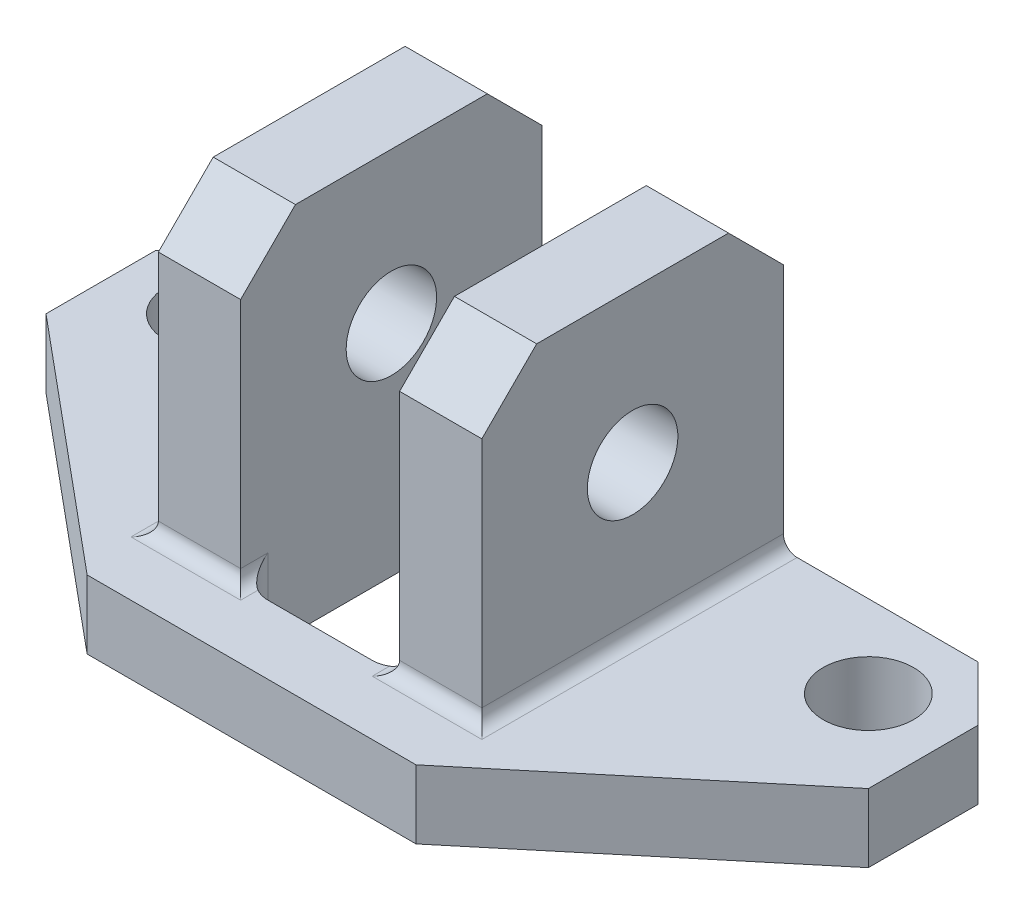
ISO-10303-21;
HEADER;
FILE_DESCRIPTION(('STEP AP214'),'2;1');
FILE_NAME('part.step','',(''),(''),'','','');
FILE_SCHEMA(('AUTOMOTIVE_DESIGN { 1 0 10303 214 1 1 1 1 }'));
ENDSEC;
DATA;
#1=APPLICATION_CONTEXT('core data for automotive mechanical design processes');
#2=APPLICATION_PROTOCOL_DEFINITION('international standard','automotive_design',2000,#1);
#3=PRODUCT_CONTEXT('',#1,'mechanical');
#4=PRODUCT('Part','Part','',(#3));
#5=PRODUCT_RELATED_PRODUCT_CATEGORY('part','',(#4));
#6=PRODUCT_DEFINITION_FORMATION('','',#4);
#7=PRODUCT_DEFINITION_CONTEXT('part definition',#1,'design');
#8=PRODUCT_DEFINITION('design','',#6,#7);
#9=PRODUCT_DEFINITION_SHAPE('','',#8);
#10=(LENGTH_UNIT() NAMED_UNIT(*) SI_UNIT(.MILLI.,.METRE.));
#11=(NAMED_UNIT(*) PLANE_ANGLE_UNIT() SI_UNIT($,.RADIAN.));
#12=(NAMED_UNIT(*) SI_UNIT($,.STERADIAN.) SOLID_ANGLE_UNIT());
#13=UNCERTAINTY_MEASURE_WITH_UNIT(LENGTH_MEASURE(1.E-05),#10,'distance_accuracy_value','');
#14=(GEOMETRIC_REPRESENTATION_CONTEXT(3) GLOBAL_UNCERTAINTY_ASSIGNED_CONTEXT((#13)) GLOBAL_UNIT_ASSIGNED_CONTEXT((#10,
#11,#12)) REPRESENTATION_CONTEXT('',''));
#15=CARTESIAN_POINT('',(0.,0.,0.));
#16=DIRECTION('',(0.,0.,1.));
#17=DIRECTION('',(1.,0.,0.));
#18=AXIS2_PLACEMENT_3D('',#15,#16,#17);
#19=CARTESIAN_POINT('',(-15.,2.5,-8.));
#20=DIRECTION('',(0.,0.,1.));
#21=DIRECTION('',(1.,0.,0.));
#22=AXIS2_PLACEMENT_3D('',#19,#20,#21);
#23=PLANE('',#22);
#24=DIRECTION('',(0.,-1.,0.));
#25=VECTOR('',#24,1.);
#26=CARTESIAN_POINT('',(-5.9,13.5,-8.));
#27=LINE('',#26,#25);
#28=CARTESIAN_POINT('',(-5.9,11.5,-8.));
#29=VERTEX_POINT('',#28);
#30=CARTESIAN_POINT('',(-5.9,3.,-8.));
#31=VERTEX_POINT('',#30);
#32=EDGE_CURVE('E283',#29,#31,#27,.T.);
#33=ORIENTED_EDGE('',*,*,#32,.F.);
#34=DIRECTION('',(1.,0.,0.));
#35=VECTOR('',#34,1.);
#36=CARTESIAN_POINT('',(-15.,11.5,-8.));
#37=LINE('',#36,#35);
#38=CARTESIAN_POINT('',(-2.9,11.5,-8.));
#39=VERTEX_POINT('',#38);
#40=EDGE_CURVE('E359',#29,#39,#37,.T.);
#41=ORIENTED_EDGE('',*,*,#40,.T.);
#42=DIRECTION('',(0.,1.,0.));
#43=VECTOR('',#42,1.);
#44=CARTESIAN_POINT('',(-2.9,0.,-8.));
#45=LINE('',#44,#43);
#46=CARTESIAN_POINT('',(-2.9,0.,-8.));
#47=VERTEX_POINT('',#46);
#48=EDGE_CURVE('E311',#47,#39,#45,.T.);
#49=ORIENTED_EDGE('',*,*,#48,.F.);
#50=DIRECTION('',(-1.,0.,0.));
#51=VECTOR('',#50,1.);
#52=CARTESIAN_POINT('',(-15.,0.,-8.));
#53=LINE('',#52,#51);
#54=CARTESIAN_POINT('',(-13.,0.,-8.));
#55=VERTEX_POINT('',#54);
#56=EDGE_CURVE('E341',#47,#55,#53,.T.);
#57=ORIENTED_EDGE('',*,*,#56,.T.);
#58=DIRECTION('',(0.,1.,0.));
#59=VECTOR('',#58,1.);
#60=CARTESIAN_POINT('',(-13.,2.5,-8.));
#61=LINE('',#60,#59);
#62=CARTESIAN_POINT('',(-13.,2.5,-8.));
#63=VERTEX_POINT('',#62);
#64=EDGE_CURVE('E356',#55,#63,#61,.T.);
#65=ORIENTED_EDGE('',*,*,#64,.T.);
#66=DIRECTION('',(-1.,0.,0.));
#67=VECTOR('',#66,1.);
#68=CARTESIAN_POINT('',(-15.,2.5,-8.));
#69=LINE('',#68,#67);
#70=CARTESIAN_POINT('',(-6.4,2.5,-8.));
#71=VERTEX_POINT('',#70);
#72=EDGE_CURVE('E331',#71,#63,#69,.T.);
#73=ORIENTED_EDGE('',*,*,#72,.F.);
#74=CARTESIAN_POINT('',(-6.4,3.,-8.));
#75=DIRECTION('',(0.,0.,1.));
#76=DIRECTION('',(1.,0.,0.));
#77=AXIS2_PLACEMENT_3D('',#74,#75,#76);
#78=CIRCLE('',#77,0.5);
#79=EDGE_CURVE('E447',#71,#31,#78,.T.);
#80=ORIENTED_EDGE('',*,*,#79,.T.);
#81=EDGE_LOOP('',(#33,#41,#49,#57,#65,#73,#80));
#82=FACE_BOUND('',#81,.T.);
#83=ADVANCED_FACE('F41',(#82),#23,.F.);
#84=CARTESIAN_POINT('',(15.,2.5,-8.));
#85=DIRECTION('',(-1.,0.,0.));
#86=DIRECTION('',(0.,0.,1.));
#87=AXIS2_PLACEMENT_3D('',#84,#85,#86);
#88=PLANE('',#87);
#89=DIRECTION('',(0.,0.,-1.));
#90=VECTOR('',#89,1.);
#91=CARTESIAN_POINT('',(15.,0.,-8.));
#92=LINE('',#91,#90);
#93=CARTESIAN_POINT('',(15.,0.,-2.));
#94=VERTEX_POINT('',#93);
#95=CARTESIAN_POINT('',(15.,0.,-5.99999999999999));
#96=VERTEX_POINT('',#95);
#97=EDGE_CURVE('E248',#94,#96,#92,.T.);
#98=ORIENTED_EDGE('',*,*,#97,.T.);
#99=DIRECTION('',(0.,1.,0.));
#100=VECTOR('',#99,1.);
#101=CARTESIAN_POINT('',(15.,2.5,-5.99999999999999));
#102=LINE('',#101,#100);
#103=CARTESIAN_POINT('',(15.,2.5,-5.99999999999999));
#104=VERTEX_POINT('',#103);
#105=EDGE_CURVE('E392',#96,#104,#102,.T.);
#106=ORIENTED_EDGE('',*,*,#105,.T.);
#107=DIRECTION('',(0.,0.,-1.));
#108=VECTOR('',#107,1.);
#109=CARTESIAN_POINT('',(15.,2.5,-8.));
#110=LINE('',#109,#108);
#111=CARTESIAN_POINT('',(15.,2.5,-2.));
#112=VERTEX_POINT('',#111);
#113=EDGE_CURVE('E328',#112,#104,#110,.T.);
#114=ORIENTED_EDGE('',*,*,#113,.F.);
#115=DIRECTION('',(0.,1.,0.));
#116=VECTOR('',#115,1.);
#117=CARTESIAN_POINT('',(15.,0.,-2.));
#118=LINE('',#117,#116);
#119=EDGE_CURVE('E249',#94,#112,#118,.T.);
#120=ORIENTED_EDGE('',*,*,#119,.F.);
#121=EDGE_LOOP('',(#98,#106,#114,#120));
#122=FACE_BOUND('',#121,.T.);
#123=ADVANCED_FACE('F498',(#122),#88,.F.);
#124=DIRECTION('',(0.,1.,0.));
#125=VECTOR('',#124,1.);
#126=CARTESIAN_POINT('',(2.9,0.,-8.));
#127=LINE('',#126,#125);
#128=CARTESIAN_POINT('',(2.9,0.,-8.));
#129=VERTEX_POINT('',#128);
#130=CARTESIAN_POINT('',(2.9,11.5,-8.));
#131=VERTEX_POINT('',#130);
#132=EDGE_CURVE('E308',#129,#131,#127,.T.);
#133=ORIENTED_EDGE('',*,*,#132,.T.);
#134=DIRECTION('',(1.,0.,0.));
#135=VECTOR('',#134,1.);
#136=CARTESIAN_POINT('',(5.9,11.5,-8.));
#137=LINE('',#136,#135);
#138=CARTESIAN_POINT('',(5.9,11.5,-8.));
#139=VERTEX_POINT('',#138);
#140=EDGE_CURVE('E386',#131,#139,#137,.T.);
#141=ORIENTED_EDGE('',*,*,#140,.T.);
#142=DIRECTION('',(0.,-1.,0.));
#143=VECTOR('',#142,1.);
#144=CARTESIAN_POINT('',(5.9,13.5,-8.));
#145=LINE('',#144,#143);
#146=CARTESIAN_POINT('',(5.9,3.,-8.));
#147=VERTEX_POINT('',#146);
#148=EDGE_CURVE('E292',#139,#147,#145,.T.);
#149=ORIENTED_EDGE('',*,*,#148,.T.);
#150=CARTESIAN_POINT('',(6.4,3.,-8.));
#151=DIRECTION('',(0.,0.,1.));
#152=DIRECTION('',(1.,0.,0.));
#153=AXIS2_PLACEMENT_3D('',#150,#151,#152);
#154=CIRCLE('',#153,0.5);
#155=CARTESIAN_POINT('',(6.4,2.5,-8.));
#156=VERTEX_POINT('',#155);
#157=EDGE_CURVE('E445',#147,#156,#154,.T.);
#158=ORIENTED_EDGE('',*,*,#157,.T.);
#159=CARTESIAN_POINT('',(13.,2.5,-8.));
#160=VERTEX_POINT('',#159);
#161=EDGE_CURVE('E333',#160,#156,#69,.T.);
#162=ORIENTED_EDGE('',*,*,#161,.F.);
#163=DIRECTION('',(0.,-1.,0.));
#164=VECTOR('',#163,1.);
#165=CARTESIAN_POINT('',(13.,2.5,-8.));
#166=LINE('',#165,#164);
#167=CARTESIAN_POINT('',(13.,0.,-8.));
#168=VERTEX_POINT('',#167);
#169=EDGE_CURVE('E383',#160,#168,#166,.T.);
#170=ORIENTED_EDGE('',*,*,#169,.T.);
#171=EDGE_CURVE('E342',#168,#129,#53,.T.);
#172=ORIENTED_EDGE('',*,*,#171,.T.);
#173=EDGE_LOOP('',(#133,#141,#149,#158,#162,#170,#172));
#174=FACE_BOUND('',#173,.T.);
#175=ADVANCED_FACE('F501',(#174),#23,.F.);
#176=CARTESIAN_POINT('',(-15.,2.5,-8.));
#177=DIRECTION('',(1.,0.,0.));
#178=DIRECTION('',(0.,0.,-1.));
#179=AXIS2_PLACEMENT_3D('',#176,#177,#178);
#180=PLANE('',#179);
#181=DIRECTION('',(0.,0.,1.));
#182=VECTOR('',#181,1.);
#183=CARTESIAN_POINT('',(-15.,2.5,-8.));
#184=LINE('',#183,#182);
#185=CARTESIAN_POINT('',(-15.,2.5,-6.));
#186=VERTEX_POINT('',#185);
#187=CARTESIAN_POINT('',(-15.,2.5,-2.));
#188=VERTEX_POINT('',#187);
#189=EDGE_CURVE('E336',#186,#188,#184,.T.);
#190=ORIENTED_EDGE('',*,*,#189,.F.);
#191=DIRECTION('',(0.,-1.,0.));
#192=VECTOR('',#191,1.);
#193=CARTESIAN_POINT('',(-15.,2.5,-6.));
#194=LINE('',#193,#192);
#195=CARTESIAN_POINT('',(-15.,0.,-6.));
#196=VERTEX_POINT('',#195);
#197=EDGE_CURVE('E398',#186,#196,#194,.T.);
#198=ORIENTED_EDGE('',*,*,#197,.T.);
#199=DIRECTION('',(0.,0.,1.));
#200=VECTOR('',#199,1.);
#201=CARTESIAN_POINT('',(-15.,0.,-8.));
#202=LINE('',#201,#200);
#203=CARTESIAN_POINT('',(-15.,0.,-2.00000000000001));
#204=VERTEX_POINT('',#203);
#205=EDGE_CURVE('E332',#196,#204,#202,.T.);
#206=ORIENTED_EDGE('',*,*,#205,.T.);
#207=DIRECTION('',(0.,1.,0.));
#208=VECTOR('',#207,1.);
#209=CARTESIAN_POINT('',(-15.,0.,-2.));
#210=LINE('',#209,#208);
#211=EDGE_CURVE('E260',#204,#188,#210,.T.);
#212=ORIENTED_EDGE('',*,*,#211,.T.);
#213=EDGE_LOOP('',(#190,#198,#206,#212));
#214=FACE_BOUND('',#213,.T.);
#215=ADVANCED_FACE('F511',(#214),#180,.F.);
#216=CARTESIAN_POINT('',(0.,2.5,0.));
#217=DIRECTION('',(0.,1.,0.));
#218=DIRECTION('',(0.,0.,1.));
#219=AXIS2_PLACEMENT_3D('',#216,#217,#218);
#220=PLANE('',#219);
#221=DIRECTION('',(-1.,0.,0.));
#222=VECTOR('',#221,1.);
#223=CARTESIAN_POINT('',(-6.,2.5,5.5));
#224=LINE('',#223,#222);
#225=CARTESIAN_POINT('',(6.00000000000001,2.5,5.49999999999999));
#226=VERTEX_POINT('',#225);
#227=CARTESIAN_POINT('',(-6.,2.5,5.5));
#228=VERTEX_POINT('',#227);
#229=EDGE_CURVE('E59',#226,#228,#224,.T.);
#230=ORIENTED_EDGE('',*,*,#229,.F.);
#231=DIRECTION('',(-0.768221279597376,0.,0.64018439966448));
#232=VECTOR('',#231,1.);
#233=CARTESIAN_POINT('',(15.,2.5,-2.));
#234=LINE('',#233,#232);
#235=EDGE_CURVE('E242',#112,#226,#234,.T.);
#236=ORIENTED_EDGE('',*,*,#235,.F.);
#237=ORIENTED_EDGE('',*,*,#113,.T.);
#238=DIRECTION('',(0.707106781186547,0.,0.707106781186548));
#239=VECTOR('',#238,1.);
#240=CARTESIAN_POINT('',(10.5,2.5,-10.5));
#241=LINE('',#240,#239);
#242=EDGE_CURVE('E396',#104,#160,#241,.F.);
#243=ORIENTED_EDGE('',*,*,#242,.T.);
#244=ORIENTED_EDGE('',*,*,#161,.T.);
#245=DIRECTION('',(0.,0.,-1.));
#246=VECTOR('',#245,1.);
#247=CARTESIAN_POINT('',(6.4,2.5,0.));
#248=LINE('',#247,#246);
#249=CARTESIAN_POINT('',(6.4,2.5,3.5));
#250=VERTEX_POINT('',#249);
#251=EDGE_CURVE('E425',#156,#250,#248,.F.);
#252=ORIENTED_EDGE('',*,*,#251,.T.);
#253=DIRECTION('',(1.,0.,0.));
#254=VECTOR('',#253,1.);
#255=CARTESIAN_POINT('',(0.,2.5,3.5));
#256=LINE('',#255,#254);
#257=CARTESIAN_POINT('',(2.4,2.5,3.5));
#258=VERTEX_POINT('',#257);
#259=EDGE_CURVE('E423',#250,#258,#256,.F.);
#260=ORIENTED_EDGE('',*,*,#259,.T.);
#261=DIRECTION('',(0.,0.,1.));
#262=VECTOR('',#261,1.);
#263=CARTESIAN_POINT('',(2.4,2.5,0.));
#264=LINE('',#263,#262);
#265=CARTESIAN_POINT('',(2.4,2.5,2.86602540378444));
#266=VERTEX_POINT('',#265);
#267=EDGE_CURVE('E421',#258,#266,#264,.F.);
#268=ORIENTED_EDGE('',*,*,#267,.T.);
#269=CARTESIAN_POINT('',(1.9,2.5,2.));
#270=DIRECTION('',(0.,1.,0.));
#271=DIRECTION('',(0.,0.,1.));
#272=AXIS2_PLACEMENT_3D('',#269,#270,#271);
#273=CIRCLE('',#272,1.);
#274=CARTESIAN_POINT('',(1.9,2.5,3.));
#275=VERTEX_POINT('',#274);
#276=EDGE_CURVE('E414',#266,#275,#273,.F.);
#277=ORIENTED_EDGE('',*,*,#276,.T.);
#278=DIRECTION('',(1.,0.,0.));
#279=VECTOR('',#278,1.);
#280=CARTESIAN_POINT('',(-2.9,2.5,3.));
#281=LINE('',#280,#279);
#282=CARTESIAN_POINT('',(-1.9,2.5,3.));
#283=VERTEX_POINT('',#282);
#284=EDGE_CURVE('E286',#283,#275,#281,.T.);
#285=ORIENTED_EDGE('',*,*,#284,.F.);
#286=CARTESIAN_POINT('',(-1.9,2.5,2.));
#287=DIRECTION('',(0.,1.,0.));
#288=DIRECTION('',(0.,0.,1.));
#289=AXIS2_PLACEMENT_3D('',#286,#287,#288);
#290=CIRCLE('',#289,1.);
#291=CARTESIAN_POINT('',(-2.4,2.5,2.86602540378444));
#292=VERTEX_POINT('',#291);
#293=EDGE_CURVE('E409',#283,#292,#290,.F.);
#294=ORIENTED_EDGE('',*,*,#293,.T.);
#295=DIRECTION('',(0.,0.,-1.));
#296=VECTOR('',#295,1.);
#297=CARTESIAN_POINT('',(-2.4,2.5,0.));
#298=LINE('',#297,#296);
#299=CARTESIAN_POINT('',(-2.4,2.5,3.5));
#300=VERTEX_POINT('',#299);
#301=EDGE_CURVE('E429',#292,#300,#298,.F.);
#302=ORIENTED_EDGE('',*,*,#301,.T.);
#303=DIRECTION('',(1.,0.,0.));
#304=VECTOR('',#303,1.);
#305=CARTESIAN_POINT('',(0.,2.5,3.5));
#306=LINE('',#305,#304);
#307=CARTESIAN_POINT('',(-6.4,2.5,3.5));
#308=VERTEX_POINT('',#307);
#309=EDGE_CURVE('E427',#300,#308,#306,.F.);
#310=ORIENTED_EDGE('',*,*,#309,.T.);
#311=DIRECTION('',(0.,0.,1.));
#312=VECTOR('',#311,1.);
#313=CARTESIAN_POINT('',(-6.4,2.5,0.));
#314=LINE('',#313,#312);
#315=EDGE_CURVE('E431',#308,#71,#314,.F.);
#316=ORIENTED_EDGE('',*,*,#315,.T.);
#317=ORIENTED_EDGE('',*,*,#72,.T.);
#318=DIRECTION('',(0.707106781186549,0.,-0.707106781186546));
#319=VECTOR('',#318,1.);
#320=CARTESIAN_POINT('',(-10.5,2.5,-10.5));
#321=LINE('',#320,#319);
#322=EDGE_CURVE('E394',#63,#186,#321,.F.);
#323=ORIENTED_EDGE('',*,*,#322,.T.);
#324=ORIENTED_EDGE('',*,*,#189,.T.);
#325=DIRECTION('',(-0.768221279597376,0.,-0.64018439966448));
#326=VECTOR('',#325,1.);
#327=CARTESIAN_POINT('',(-15.,2.5,-2.));
#328=LINE('',#327,#326);
#329=EDGE_CURVE('E251',#228,#188,#328,.T.);
#330=ORIENTED_EDGE('',*,*,#329,.F.);
#331=EDGE_LOOP('',(#230,#236,#237,#243,#244,#252,#260,#268,#277,#285,#294,#302,#310,#316,#317,
#323,#324,#330));
#332=FACE_BOUND('',#331,.T.);
#333=CARTESIAN_POINT('',(12.,2.5,-5.));
#334=DIRECTION('',(0.,1.,0.));
#335=DIRECTION('',(0.,0.,-1.));
#336=AXIS2_PLACEMENT_3D('',#333,#334,#335);
#337=CIRCLE('',#336,1.64999999999999);
#338=CARTESIAN_POINT('',(12.,2.5,-6.64999999999999));
#339=VERTEX_POINT('',#338);
#340=EDGE_CURVE('E317',#339,#339,#337,.T.);
#341=ORIENTED_EDGE('',*,*,#340,.F.);
#342=EDGE_LOOP('',(#341));
#343=FACE_BOUND('',#342,.T.);
#344=CARTESIAN_POINT('',(-12.,2.5,-5.));
#345=DIRECTION('',(0.,1.,0.));
#346=DIRECTION('',(0.,0.,1.));
#347=AXIS2_PLACEMENT_3D('',#344,#345,#346);
#348=CIRCLE('',#347,1.65);
#349=CARTESIAN_POINT('',(-12.,2.5,-3.35));
#350=VERTEX_POINT('',#349);
#351=EDGE_CURVE('E320',#350,#350,#348,.T.);
#352=ORIENTED_EDGE('',*,*,#351,.F.);
#353=EDGE_LOOP('',(#352));
#354=FACE_BOUND('',#353,.T.);
#355=ADVANCED_FACE('F517',(#332,#343,#354),#220,.T.);
#356=CARTESIAN_POINT('',(0.,0.,0.));
#357=DIRECTION('',(0.,1.,0.));
#358=DIRECTION('',(0.,0.,1.));
#359=AXIS2_PLACEMENT_3D('',#356,#357,#358);
#360=PLANE('',#359);
#361=DIRECTION('',(-0.768221279597376,0.,0.64018439966448));
#362=VECTOR('',#361,1.);
#363=CARTESIAN_POINT('',(15.,0.,-2.));
#364=LINE('',#363,#362);
#365=CARTESIAN_POINT('',(6.00000000000001,0.,5.49999999999999));
#366=VERTEX_POINT('',#365);
#367=EDGE_CURVE('E239',#94,#366,#364,.T.);
#368=ORIENTED_EDGE('',*,*,#367,.T.);
#369=DIRECTION('',(-1.,0.,0.));
#370=VECTOR('',#369,1.);
#371=CARTESIAN_POINT('',(-6.,0.,5.5));
#372=LINE('',#371,#370);
#373=CARTESIAN_POINT('',(-6.,0.,5.5));
#374=VERTEX_POINT('',#373);
#375=EDGE_CURVE('E227',#366,#374,#372,.T.);
#376=ORIENTED_EDGE('',*,*,#375,.T.);
#377=DIRECTION('',(-0.768221279597376,0.,-0.64018439966448));
#378=VECTOR('',#377,1.);
#379=CARTESIAN_POINT('',(-15.,0.,-2.));
#380=LINE('',#379,#378);
#381=EDGE_CURVE('E578',#374,#204,#380,.T.);
#382=ORIENTED_EDGE('',*,*,#381,.T.);
#383=ORIENTED_EDGE('',*,*,#205,.F.);
#384=DIRECTION('',(-0.707106781186549,0.,0.707106781186546));
#385=VECTOR('',#384,1.);
#386=CARTESIAN_POINT('',(-15.,0.,-6.));
#387=LINE('',#386,#385);
#388=EDGE_CURVE('E388',#196,#55,#387,.F.);
#389=ORIENTED_EDGE('',*,*,#388,.T.);
#390=ORIENTED_EDGE('',*,*,#56,.F.);
#391=DIRECTION('',(0.,0.,1.));
#392=VECTOR('',#391,1.);
#393=CARTESIAN_POINT('',(-2.9,0.,-8.));
#394=LINE('',#393,#392);
#395=CARTESIAN_POINT('',(-2.9,0.,2.));
#396=VERTEX_POINT('',#395);
#397=EDGE_CURVE('E300',#47,#396,#394,.T.);
#398=ORIENTED_EDGE('',*,*,#397,.T.);
#399=CARTESIAN_POINT('',(-1.9,0.,2.));
#400=DIRECTION('',(0.,1.,0.));
#401=DIRECTION('',(0.,0.,1.));
#402=AXIS2_PLACEMENT_3D('',#399,#400,#401);
#403=CIRCLE('',#402,1.);
#404=CARTESIAN_POINT('',(-1.9,0.,3.));
#405=VERTEX_POINT('',#404);
#406=EDGE_CURVE('E412',#396,#405,#403,.T.);
#407=ORIENTED_EDGE('',*,*,#406,.T.);
#408=DIRECTION('',(1.,0.,0.));
#409=VECTOR('',#408,1.);
#410=CARTESIAN_POINT('',(-2.9,0.,3.));
#411=LINE('',#410,#409);
#412=CARTESIAN_POINT('',(1.9,0.,3.));
#413=VERTEX_POINT('',#412);
#414=EDGE_CURVE('E303',#405,#413,#411,.T.);
#415=ORIENTED_EDGE('',*,*,#414,.T.);
#416=CARTESIAN_POINT('',(1.9,0.,2.));
#417=DIRECTION('',(0.,1.,0.));
#418=DIRECTION('',(0.,0.,1.));
#419=AXIS2_PLACEMENT_3D('',#416,#417,#418);
#420=CIRCLE('',#419,1.);
#421=CARTESIAN_POINT('',(2.9,0.,2.));
#422=VERTEX_POINT('',#421);
#423=EDGE_CURVE('E416',#413,#422,#420,.T.);
#424=ORIENTED_EDGE('',*,*,#423,.T.);
#425=DIRECTION('',(0.,0.,-1.));
#426=VECTOR('',#425,1.);
#427=CARTESIAN_POINT('',(2.9,0.,-8.));
#428=LINE('',#427,#426);
#429=EDGE_CURVE('E306',#422,#129,#428,.T.);
#430=ORIENTED_EDGE('',*,*,#429,.T.);
#431=ORIENTED_EDGE('',*,*,#171,.F.);
#432=DIRECTION('',(-0.707106781186547,0.,-0.707106781186548));
#433=VECTOR('',#432,1.);
#434=CARTESIAN_POINT('',(13.,0.,-8.));
#435=LINE('',#434,#433);
#436=EDGE_CURVE('E390',#168,#96,#435,.F.);
#437=ORIENTED_EDGE('',*,*,#436,.T.);
#438=ORIENTED_EDGE('',*,*,#97,.F.);
#439=EDGE_LOOP('',(#368,#376,#382,#383,#389,#390,#398,#407,#415,#424,#430,#431,#437,#438));
#440=FACE_BOUND('',#439,.T.);
#441=CARTESIAN_POINT('',(12.,0.,-5.));
#442=DIRECTION('',(0.,1.,0.));
#443=DIRECTION('',(0.,0.,-1.));
#444=AXIS2_PLACEMENT_3D('',#441,#442,#443);
#445=CIRCLE('',#444,1.64999999999999);
#446=CARTESIAN_POINT('',(12.,0.,-6.64999999999999));
#447=VERTEX_POINT('',#446);
#448=EDGE_CURVE('E314',#447,#447,#445,.T.);
#449=ORIENTED_EDGE('',*,*,#448,.T.);
#450=EDGE_LOOP('',(#449));
#451=FACE_BOUND('',#450,.T.);
#452=CARTESIAN_POINT('',(-12.,0.,-5.));
#453=DIRECTION('',(0.,1.,0.));
#454=DIRECTION('',(0.,0.,1.));
#455=AXIS2_PLACEMENT_3D('',#452,#453,#454);
#456=CIRCLE('',#455,1.65);
#457=CARTESIAN_POINT('',(-12.,0.,-3.35));
#458=VERTEX_POINT('',#457);
#459=EDGE_CURVE('E323',#458,#458,#456,.T.);
#460=ORIENTED_EDGE('',*,*,#459,.T.);
#461=EDGE_LOOP('',(#460));
#462=FACE_BOUND('',#461,.T.);
#463=ADVANCED_FACE('F245',(#440,#451,#462),#360,.F.);
#464=CARTESIAN_POINT('',(-12.,0.,-5.));
#465=DIRECTION('',(0.,1.,0.));
#466=DIRECTION('',(0.,0.,1.));
#467=AXIS2_PLACEMENT_3D('',#464,#465,#466);
#468=CYLINDRICAL_SURFACE('',#467,1.65);
#469=ORIENTED_EDGE('',*,*,#459,.F.);
#470=EDGE_LOOP('',(#469));
#471=FACE_BOUND('',#470,.T.);
#472=ORIENTED_EDGE('',*,*,#351,.T.);
#473=EDGE_LOOP('',(#472));
#474=FACE_BOUND('',#473,.T.);
#475=ADVANCED_FACE('F644',(#471,#474),#468,.F.);
#476=CARTESIAN_POINT('',(12.,0.,-5.));
#477=DIRECTION('',(0.,1.,0.));
#478=DIRECTION('',(0.,0.,1.));
#479=AXIS2_PLACEMENT_3D('',#476,#477,#478);
#480=CYLINDRICAL_SURFACE('',#479,1.64999999999999);
#481=ORIENTED_EDGE('',*,*,#448,.F.);
#482=EDGE_LOOP('',(#481));
#483=FACE_BOUND('',#482,.T.);
#484=ORIENTED_EDGE('',*,*,#340,.T.);
#485=EDGE_LOOP('',(#484));
#486=FACE_BOUND('',#485,.T.);
#487=ADVANCED_FACE('F640',(#483,#486),#480,.F.);
#488=CARTESIAN_POINT('',(-2.9,0.,-8.));
#489=DIRECTION('',(-1.,0.,0.));
#490=DIRECTION('',(0.,0.,1.));
#491=AXIS2_PLACEMENT_3D('',#488,#489,#490);
#492=PLANE('',#491);
#493=CARTESIAN_POINT('',(-2.9,8.,-2.5));
#494=DIRECTION('',(-1.,0.,0.));
#495=DIRECTION('',(0.,0.,1.));
#496=AXIS2_PLACEMENT_3D('',#493,#494,#495);
#497=CIRCLE('',#496,1.65);
#498=CARTESIAN_POINT('',(-2.9,8.,-0.850000000000001));
#499=VERTEX_POINT('',#498);
#500=EDGE_CURVE('E266',#499,#499,#497,.T.);
#501=ORIENTED_EDGE('',*,*,#500,.T.);
#502=EDGE_LOOP('',(#501));
#503=FACE_BOUND('',#502,.T.);
#504=DIRECTION('',(0.,-1.,0.));
#505=VECTOR('',#504,1.);
#506=CARTESIAN_POINT('',(-2.9,13.5,3.));
#507=LINE('',#506,#505);
#508=CARTESIAN_POINT('',(-2.9,11.5,3.));
#509=VERTEX_POINT('',#508);
#510=CARTESIAN_POINT('',(-2.9,3.,3.));
#511=VERTEX_POINT('',#510);
#512=EDGE_CURVE('E277',#509,#511,#507,.T.);
#513=ORIENTED_EDGE('',*,*,#512,.T.);
#514=DIRECTION('',(0.,0.,-1.));
#515=VECTOR('',#514,1.);
#516=CARTESIAN_POINT('',(-2.9,3.,-8.));
#517=LINE('',#516,#515);
#518=CARTESIAN_POINT('',(-2.9,3.,2.));
#519=VERTEX_POINT('',#518);
#520=EDGE_CURVE('E436',#511,#519,#517,.T.);
#521=ORIENTED_EDGE('',*,*,#520,.T.);
#522=DIRECTION('',(0.,1.,0.));
#523=VECTOR('',#522,1.);
#524=CARTESIAN_POINT('',(-2.9,0.,2.));
#525=LINE('',#524,#523);
#526=EDGE_CURVE('E406',#519,#396,#525,.F.);
#527=ORIENTED_EDGE('',*,*,#526,.T.);
#528=ORIENTED_EDGE('',*,*,#397,.F.);
#529=ORIENTED_EDGE('',*,*,#48,.T.);
#530=DIRECTION('',(0.,-0.707106781186549,-0.707106781186546));
#531=VECTOR('',#530,1.);
#532=CARTESIAN_POINT('',(-2.9,13.5,-6.00000000000001));
#533=LINE('',#532,#531);
#534=CARTESIAN_POINT('',(-2.9,13.5,-6.00000000000001));
#535=VERTEX_POINT('',#534);
#536=EDGE_CURVE('E363',#39,#535,#533,.F.);
#537=ORIENTED_EDGE('',*,*,#536,.T.);
#538=DIRECTION('',(0.,0.,-1.));
#539=VECTOR('',#538,1.);
#540=CARTESIAN_POINT('',(-2.9,13.5,-8.));
#541=LINE('',#540,#539);
#542=CARTESIAN_POINT('',(-2.9,13.5,0.999999999999997));
#543=VERTEX_POINT('',#542);
#544=EDGE_CURVE('E270',#543,#535,#541,.T.);
#545=ORIENTED_EDGE('',*,*,#544,.F.);
#546=DIRECTION('',(0.,0.707106781186548,-0.707106781186547));
#547=VECTOR('',#546,1.);
#548=CARTESIAN_POINT('',(-2.9,13.5,0.999999999999998));
#549=LINE('',#548,#547);
#550=EDGE_CURVE('E361',#543,#509,#549,.F.);
#551=ORIENTED_EDGE('',*,*,#550,.T.);
#552=EDGE_LOOP('',(#513,#521,#527,#528,#529,#537,#545,#551));
#553=FACE_BOUND('',#552,.T.);
#554=ADVANCED_FACE('F597',(#503,#553),#492,.F.);
#555=CARTESIAN_POINT('',(2.9,0.,-8.));
#556=DIRECTION('',(1.,0.,0.));
#557=DIRECTION('',(0.,0.,-1.));
#558=AXIS2_PLACEMENT_3D('',#555,#556,#557);
#559=PLANE('',#558);
#560=CARTESIAN_POINT('',(2.9,8.,-2.5));
#561=DIRECTION('',(1.,0.,0.));
#562=DIRECTION('',(0.,0.,-1.));
#563=AXIS2_PLACEMENT_3D('',#560,#561,#562);
#564=CIRCLE('',#563,1.65);
#565=CARTESIAN_POINT('',(2.9,8.,-4.15));
#566=VERTEX_POINT('',#565);
#567=EDGE_CURVE('E263',#566,#566,#564,.T.);
#568=ORIENTED_EDGE('',*,*,#567,.T.);
#569=EDGE_LOOP('',(#568));
#570=FACE_BOUND('',#569,.T.);
#571=DIRECTION('',(0.,1.,0.));
#572=VECTOR('',#571,1.);
#573=CARTESIAN_POINT('',(2.9,2.5,2.));
#574=LINE('',#573,#572);
#575=CARTESIAN_POINT('',(2.9,3.,2.));
#576=VERTEX_POINT('',#575);
#577=EDGE_CURVE('E67',#422,#576,#574,.T.);
#578=ORIENTED_EDGE('',*,*,#577,.T.);
#579=DIRECTION('',(0.,0.,1.));
#580=VECTOR('',#579,1.);
#581=CARTESIAN_POINT('',(2.9,3.,-8.));
#582=LINE('',#581,#580);
#583=CARTESIAN_POINT('',(2.9,3.,3.));
#584=VERTEX_POINT('',#583);
#585=EDGE_CURVE('E443',#576,#584,#582,.T.);
#586=ORIENTED_EDGE('',*,*,#585,.T.);
#587=DIRECTION('',(0.,-1.,0.));
#588=VECTOR('',#587,1.);
#589=CARTESIAN_POINT('',(2.9,13.5,3.));
#590=LINE('',#589,#588);
#591=CARTESIAN_POINT('',(2.9,11.5,3.));
#592=VERTEX_POINT('',#591);
#593=EDGE_CURVE('E269',#592,#584,#590,.T.);
#594=ORIENTED_EDGE('',*,*,#593,.F.);
#595=DIRECTION('',(0.,0.707106781186548,-0.707106781186547));
#596=VECTOR('',#595,1.);
#597=CARTESIAN_POINT('',(2.9,13.5,0.999999999999997));
#598=LINE('',#597,#596);
#599=CARTESIAN_POINT('',(2.9,13.5,0.999999999999997));
#600=VERTEX_POINT('',#599);
#601=EDGE_CURVE('E381',#592,#600,#598,.T.);
#602=ORIENTED_EDGE('',*,*,#601,.T.);
#603=DIRECTION('',(0.,0.,1.));
#604=VECTOR('',#603,1.);
#605=CARTESIAN_POINT('',(2.9,13.5,-8.));
#606=LINE('',#605,#604);
#607=CARTESIAN_POINT('',(2.9,13.5,-6.00000000000001));
#608=VERTEX_POINT('',#607);
#609=EDGE_CURVE('E274',#608,#600,#606,.T.);
#610=ORIENTED_EDGE('',*,*,#609,.F.);
#611=DIRECTION('',(0.,-0.707106781186549,-0.707106781186546));
#612=VECTOR('',#611,1.);
#613=CARTESIAN_POINT('',(2.9,13.5,-6.00000000000001));
#614=LINE('',#613,#612);
#615=EDGE_CURVE('E379',#608,#131,#614,.T.);
#616=ORIENTED_EDGE('',*,*,#615,.T.);
#617=ORIENTED_EDGE('',*,*,#132,.F.);
#618=ORIENTED_EDGE('',*,*,#429,.F.);
#619=EDGE_LOOP('',(#578,#586,#594,#602,#610,#616,#617,#618));
#620=FACE_BOUND('',#619,.T.);
#621=ADVANCED_FACE('F561',(#570,#620),#559,.F.);
#622=CARTESIAN_POINT('',(-2.9,0.,3.));
#623=DIRECTION('',(0.,0.,1.));
#624=DIRECTION('',(1.,0.,0.));
#625=AXIS2_PLACEMENT_3D('',#622,#623,#624);
#626=PLANE('',#625);
#627=ORIENTED_EDGE('',*,*,#414,.F.);
#628=DIRECTION('',(0.,1.,0.));
#629=VECTOR('',#628,1.);
#630=CARTESIAN_POINT('',(-1.9,2.5,3.));
#631=LINE('',#630,#629);
#632=EDGE_CURVE('E403',#405,#283,#631,.T.);
#633=ORIENTED_EDGE('',*,*,#632,.T.);
#634=ORIENTED_EDGE('',*,*,#284,.T.);
#635=DIRECTION('',(0.,1.,0.));
#636=VECTOR('',#635,1.);
#637=CARTESIAN_POINT('',(1.9,0.,3.));
#638=LINE('',#637,#636);
#639=EDGE_CURVE('E401',#275,#413,#638,.F.);
#640=ORIENTED_EDGE('',*,*,#639,.T.);
#641=EDGE_LOOP('',(#627,#633,#634,#640));
#642=FACE_BOUND('',#641,.T.);
#643=ADVANCED_FACE('F627',(#642),#626,.F.);
#644=CARTESIAN_POINT('',(2.9,13.5,3.));
#645=DIRECTION('',(0.,0.,-1.));
#646=DIRECTION('',(-1.,0.,0.));
#647=AXIS2_PLACEMENT_3D('',#644,#645,#646);
#648=PLANE('',#647);
#649=ORIENTED_EDGE('',*,*,#593,.T.);
#650=DIRECTION('',(1.,0.,0.));
#651=VECTOR('',#650,1.);
#652=CARTESIAN_POINT('',(2.9,3.,3.));
#653=LINE('',#652,#651);
#654=CARTESIAN_POINT('',(5.9,3.,3.));
#655=VERTEX_POINT('',#654);
#656=EDGE_CURVE('E441',#584,#655,#653,.T.);
#657=ORIENTED_EDGE('',*,*,#656,.T.);
#658=DIRECTION('',(0.,-1.,0.));
#659=VECTOR('',#658,1.);
#660=CARTESIAN_POINT('',(5.9,13.5,3.));
#661=LINE('',#660,#659);
#662=CARTESIAN_POINT('',(5.9,11.5,3.));
#663=VERTEX_POINT('',#662);
#664=EDGE_CURVE('E289',#663,#655,#661,.T.);
#665=ORIENTED_EDGE('',*,*,#664,.F.);
#666=DIRECTION('',(-1.,0.,0.));
#667=VECTOR('',#666,1.);
#668=CARTESIAN_POINT('',(2.9,11.5,3.));
#669=LINE('',#668,#667);
#670=EDGE_CURVE('E377',#663,#592,#669,.T.);
#671=ORIENTED_EDGE('',*,*,#670,.T.);
#672=EDGE_LOOP('',(#649,#657,#665,#671));
#673=FACE_BOUND('',#672,.T.);
#674=ADVANCED_FACE('F541',(#673),#648,.F.);
#675=CARTESIAN_POINT('',(5.9,13.5,-8.));
#676=DIRECTION('',(-1.,0.,0.));
#677=DIRECTION('',(0.,0.,1.));
#678=AXIS2_PLACEMENT_3D('',#675,#676,#677);
#679=PLANE('',#678);
#680=CARTESIAN_POINT('',(5.9,8.,-2.5));
#681=DIRECTION('',(-1.,0.,0.));
#682=DIRECTION('',(0.,0.,1.));
#683=AXIS2_PLACEMENT_3D('',#680,#681,#682);
#684=CIRCLE('',#683,1.65);
#685=CARTESIAN_POINT('',(5.9,8.,-0.850000000000002));
#686=VERTEX_POINT('',#685);
#687=EDGE_CURVE('E259',#686,#686,#684,.T.);
#688=ORIENTED_EDGE('',*,*,#687,.T.);
#689=EDGE_LOOP('',(#688));
#690=FACE_BOUND('',#689,.T.);
#691=ORIENTED_EDGE('',*,*,#664,.T.);
#692=DIRECTION('',(0.,0.,-1.));
#693=VECTOR('',#692,1.);
#694=CARTESIAN_POINT('',(5.9,3.,-8.));
#695=LINE('',#694,#693);
#696=EDGE_CURVE('E418',#655,#147,#695,.T.);
#697=ORIENTED_EDGE('',*,*,#696,.T.);
#698=ORIENTED_EDGE('',*,*,#148,.F.);
#699=DIRECTION('',(0.,0.707106781186549,0.707106781186546));
#700=VECTOR('',#699,1.);
#701=CARTESIAN_POINT('',(5.9,13.5,-6.00000000000001));
#702=LINE('',#701,#700);
#703=CARTESIAN_POINT('',(5.9,13.5,-6.00000000000001));
#704=VERTEX_POINT('',#703);
#705=EDGE_CURVE('E373',#139,#704,#702,.T.);
#706=ORIENTED_EDGE('',*,*,#705,.T.);
#707=DIRECTION('',(0.,0.,-1.));
#708=VECTOR('',#707,1.);
#709=CARTESIAN_POINT('',(5.9,13.5,-8.));
#710=LINE('',#709,#708);
#711=CARTESIAN_POINT('',(5.9,13.5,0.999999999999997));
#712=VERTEX_POINT('',#711);
#713=EDGE_CURVE('E295',#712,#704,#710,.T.);
#714=ORIENTED_EDGE('',*,*,#713,.F.);
#715=DIRECTION('',(0.,-0.707106781186548,0.707106781186547));
#716=VECTOR('',#715,1.);
#717=CARTESIAN_POINT('',(5.9,13.5,0.999999999999997));
#718=LINE('',#717,#716);
#719=EDGE_CURVE('E375',#712,#663,#718,.T.);
#720=ORIENTED_EDGE('',*,*,#719,.T.);
#721=EDGE_LOOP('',(#691,#697,#698,#706,#714,#720));
#722=FACE_BOUND('',#721,.T.);
#723=ADVANCED_FACE('F529',(#690,#722),#679,.F.);
#724=CARTESIAN_POINT('',(0.,13.5,0.));
#725=DIRECTION('',(0.,1.,0.));
#726=DIRECTION('',(0.,0.,1.));
#727=AXIS2_PLACEMENT_3D('',#724,#725,#726);
#728=PLANE('',#727);
#729=ORIENTED_EDGE('',*,*,#609,.T.);
#730=DIRECTION('',(1.,0.,0.));
#731=VECTOR('',#730,1.);
#732=CARTESIAN_POINT('',(5.9,13.5,0.999999999999997));
#733=LINE('',#732,#731);
#734=EDGE_CURVE('E370',#600,#712,#733,.T.);
#735=ORIENTED_EDGE('',*,*,#734,.T.);
#736=ORIENTED_EDGE('',*,*,#713,.T.);
#737=DIRECTION('',(-1.,0.,0.));
#738=VECTOR('',#737,1.);
#739=CARTESIAN_POINT('',(2.9,13.5,-6.00000000000001));
#740=LINE('',#739,#738);
#741=EDGE_CURVE('E367',#704,#608,#740,.T.);
#742=ORIENTED_EDGE('',*,*,#741,.T.);
#743=EDGE_LOOP('',(#729,#735,#736,#742));
#744=FACE_BOUND('',#743,.T.);
#745=ADVANCED_FACE('F531',(#744),#728,.T.);
#746=CARTESIAN_POINT('',(-5.9,13.5,-8.));
#747=DIRECTION('',(1.,0.,0.));
#748=DIRECTION('',(0.,0.,-1.));
#749=AXIS2_PLACEMENT_3D('',#746,#747,#748);
#750=PLANE('',#749);
#751=CARTESIAN_POINT('',(-5.9,8.,-2.5));
#752=DIRECTION('',(-1.,0.,0.));
#753=DIRECTION('',(0.,0.,1.));
#754=AXIS2_PLACEMENT_3D('',#751,#752,#753);
#755=CIRCLE('',#754,1.65);
#756=CARTESIAN_POINT('',(-5.9,8.,-0.850000000000001));
#757=VERTEX_POINT('',#756);
#758=EDGE_CURVE('E256',#757,#757,#755,.T.);
#759=ORIENTED_EDGE('',*,*,#758,.F.);
#760=EDGE_LOOP('',(#759));
#761=FACE_BOUND('',#760,.T.);
#762=ORIENTED_EDGE('',*,*,#32,.T.);
#763=DIRECTION('',(0.,0.,1.));
#764=VECTOR('',#763,1.);
#765=CARTESIAN_POINT('',(-5.9,3.,-8.));
#766=LINE('',#765,#764);
#767=CARTESIAN_POINT('',(-5.9,3.,3.));
#768=VERTEX_POINT('',#767);
#769=EDGE_CURVE('E433',#31,#768,#766,.T.);
#770=ORIENTED_EDGE('',*,*,#769,.T.);
#771=DIRECTION('',(0.,-1.,0.));
#772=VECTOR('',#771,1.);
#773=CARTESIAN_POINT('',(-5.9,13.5,3.));
#774=LINE('',#773,#772);
#775=CARTESIAN_POINT('',(-5.9,11.5,3.));
#776=VERTEX_POINT('',#775);
#777=EDGE_CURVE('E280',#776,#768,#774,.T.);
#778=ORIENTED_EDGE('',*,*,#777,.F.);
#779=DIRECTION('',(0.,-0.707106781186548,0.707106781186547));
#780=VECTOR('',#779,1.);
#781=CARTESIAN_POINT('',(-5.9,13.5,0.999999999999998));
#782=LINE('',#781,#780);
#783=CARTESIAN_POINT('',(-5.9,13.5,0.999999999999997));
#784=VERTEX_POINT('',#783);
#785=EDGE_CURVE('E352',#776,#784,#782,.F.);
#786=ORIENTED_EDGE('',*,*,#785,.T.);
#787=DIRECTION('',(0.,0.,1.));
#788=VECTOR('',#787,1.);
#789=CARTESIAN_POINT('',(-5.9,13.5,-8.));
#790=LINE('',#789,#788);
#791=CARTESIAN_POINT('',(-5.9,13.5,-6.00000000000001));
#792=VERTEX_POINT('',#791);
#793=EDGE_CURVE('E273',#792,#784,#790,.T.);
#794=ORIENTED_EDGE('',*,*,#793,.F.);
#795=DIRECTION('',(0.,0.707106781186549,0.707106781186546));
#796=VECTOR('',#795,1.);
#797=CARTESIAN_POINT('',(-5.9,13.5,-6.00000000000001));
#798=LINE('',#797,#796);
#799=EDGE_CURVE('E354',#792,#29,#798,.F.);
#800=ORIENTED_EDGE('',*,*,#799,.T.);
#801=EDGE_LOOP('',(#762,#770,#778,#786,#794,#800));
#802=FACE_BOUND('',#801,.T.);
#803=ADVANCED_FACE('F607',(#761,#802),#750,.F.);
#804=CARTESIAN_POINT('',(-2.9,13.5,3.));
#805=DIRECTION('',(0.,0.,-1.));
#806=DIRECTION('',(-1.,0.,0.));
#807=AXIS2_PLACEMENT_3D('',#804,#805,#806);
#808=PLANE('',#807);
#809=ORIENTED_EDGE('',*,*,#777,.T.);
#810=DIRECTION('',(1.,0.,0.));
#811=VECTOR('',#810,1.);
#812=CARTESIAN_POINT('',(-2.9,3.,3.));
#813=LINE('',#812,#811);
#814=EDGE_CURVE('E439',#768,#511,#813,.T.);
#815=ORIENTED_EDGE('',*,*,#814,.T.);
#816=ORIENTED_EDGE('',*,*,#512,.F.);
#817=DIRECTION('',(-1.,0.,0.));
#818=VECTOR('',#817,1.);
#819=CARTESIAN_POINT('',(-2.9,11.5,3.));
#820=LINE('',#819,#818);
#821=EDGE_CURVE('E365',#509,#776,#820,.T.);
#822=ORIENTED_EDGE('',*,*,#821,.T.);
#823=EDGE_LOOP('',(#809,#815,#816,#822));
#824=FACE_BOUND('',#823,.T.);
#825=ADVANCED_FACE('F616',(#824),#808,.F.);
#826=CARTESIAN_POINT('',(0.,13.5,0.));
#827=DIRECTION('',(0.,-1.,0.));
#828=DIRECTION('',(0.,0.,-1.));
#829=AXIS2_PLACEMENT_3D('',#826,#827,#828);
#830=PLANE('',#829);
#831=ORIENTED_EDGE('',*,*,#544,.T.);
#832=DIRECTION('',(-1.,0.,0.));
#833=VECTOR('',#832,1.);
#834=CARTESIAN_POINT('',(0.,13.5,-6.00000000000001));
#835=LINE('',#834,#833);
#836=EDGE_CURVE('E349',#535,#792,#835,.T.);
#837=ORIENTED_EDGE('',*,*,#836,.T.);
#838=ORIENTED_EDGE('',*,*,#793,.T.);
#839=DIRECTION('',(1.,0.,0.));
#840=VECTOR('',#839,1.);
#841=CARTESIAN_POINT('',(0.,13.5,0.999999999999997));
#842=LINE('',#841,#840);
#843=EDGE_CURVE('E339',#784,#543,#842,.T.);
#844=ORIENTED_EDGE('',*,*,#843,.T.);
#845=EDGE_LOOP('',(#831,#837,#838,#844));
#846=FACE_BOUND('',#845,.T.);
#847=ADVANCED_FACE('F604',(#846),#830,.F.);
#848=CARTESIAN_POINT('',(15.,8.,-2.5));
#849=DIRECTION('',(-1.,0.,0.));
#850=DIRECTION('',(0.,0.,1.));
#851=AXIS2_PLACEMENT_3D('',#848,#849,#850);
#852=CYLINDRICAL_SURFACE('',#851,1.65);
#853=ORIENTED_EDGE('',*,*,#758,.T.);
#854=EDGE_LOOP('',(#853));
#855=FACE_BOUND('',#854,.T.);
#856=ORIENTED_EDGE('',*,*,#500,.F.);
#857=EDGE_LOOP('',(#856));
#858=FACE_BOUND('',#857,.T.);
#859=ADVANCED_FACE('F780',(#855,#858),#852,.F.);
#860=ORIENTED_EDGE('',*,*,#687,.F.);
#861=EDGE_LOOP('',(#860));
#862=FACE_BOUND('',#861,.T.);
#863=ORIENTED_EDGE('',*,*,#567,.F.);
#864=EDGE_LOOP('',(#863));
#865=FACE_BOUND('',#864,.T.);
#866=ADVANCED_FACE('F664',(#862,#865),#852,.F.);
#867=CARTESIAN_POINT('',(15.,0.,-2.));
#868=DIRECTION('',(-0.64018439966448,0.,-0.768221279597376));
#869=DIRECTION('',(-0.768221279597376,0.,0.64018439966448));
#870=AXIS2_PLACEMENT_3D('',#867,#868,#869);
#871=PLANE('',#870);
#872=ORIENTED_EDGE('',*,*,#235,.T.);
#873=DIRECTION('',(0.,1.,0.));
#874=VECTOR('',#873,1.);
#875=CARTESIAN_POINT('',(6.00000000000001,0.,5.49999999999999));
#876=LINE('',#875,#874);
#877=EDGE_CURVE('E230',#366,#226,#876,.T.);
#878=ORIENTED_EDGE('',*,*,#877,.F.);
#879=ORIENTED_EDGE('',*,*,#367,.F.);
#880=ORIENTED_EDGE('',*,*,#119,.T.);
#881=EDGE_LOOP('',(#872,#878,#879,#880));
#882=FACE_BOUND('',#881,.T.);
#883=ADVANCED_FACE('F238',(#882),#871,.F.);
#884=CARTESIAN_POINT('',(-15.,0.,-2.));
#885=DIRECTION('',(0.64018439966448,0.,-0.768221279597376));
#886=DIRECTION('',(-0.768221279597376,0.,-0.64018439966448));
#887=AXIS2_PLACEMENT_3D('',#884,#885,#886);
#888=PLANE('',#887);
#889=ORIENTED_EDGE('',*,*,#381,.F.);
#890=DIRECTION('',(0.,1.,0.));
#891=VECTOR('',#890,1.);
#892=CARTESIAN_POINT('',(-6.,0.,5.5));
#893=LINE('',#892,#891);
#894=EDGE_CURVE('E231',#374,#228,#893,.T.);
#895=ORIENTED_EDGE('',*,*,#894,.T.);
#896=ORIENTED_EDGE('',*,*,#329,.T.);
#897=ORIENTED_EDGE('',*,*,#211,.F.);
#898=EDGE_LOOP('',(#889,#895,#896,#897));
#899=FACE_BOUND('',#898,.T.);
#900=ADVANCED_FACE('F586',(#899),#888,.F.);
#901=CARTESIAN_POINT('',(0.,13.5,-6.00000000000001));
#902=DIRECTION('',(0.,-0.707106781186546,0.707106781186549));
#903=DIRECTION('',(-1.,0.,0.));
#904=AXIS2_PLACEMENT_3D('',#901,#902,#903);
#905=PLANE('',#904);
#906=ORIENTED_EDGE('',*,*,#536,.F.);
#907=ORIENTED_EDGE('',*,*,#40,.F.);
#908=ORIENTED_EDGE('',*,*,#799,.F.);
#909=ORIENTED_EDGE('',*,*,#836,.F.);
#910=EDGE_LOOP('',(#906,#907,#908,#909));
#911=FACE_BOUND('',#910,.T.);
#912=ADVANCED_FACE('F601',(#911),#905,.F.);
#913=CARTESIAN_POINT('',(0.,13.5,0.999999999999997));
#914=DIRECTION('',(0.,-0.707106781186547,-0.707106781186548));
#915=DIRECTION('',(1.,0.,0.));
#916=AXIS2_PLACEMENT_3D('',#913,#914,#915);
#917=PLANE('',#916);
#918=ORIENTED_EDGE('',*,*,#785,.F.);
#919=ORIENTED_EDGE('',*,*,#821,.F.);
#920=ORIENTED_EDGE('',*,*,#550,.F.);
#921=ORIENTED_EDGE('',*,*,#843,.F.);
#922=EDGE_LOOP('',(#918,#919,#920,#921));
#923=FACE_BOUND('',#922,.T.);
#924=ADVANCED_FACE('F612',(#923),#917,.F.);
#925=CARTESIAN_POINT('',(0.,13.5,0.999999999999997));
#926=DIRECTION('',(0.,0.707106781186547,0.707106781186548));
#927=DIRECTION('',(-1.,0.,0.));
#928=AXIS2_PLACEMENT_3D('',#925,#926,#927);
#929=PLANE('',#928);
#930=ORIENTED_EDGE('',*,*,#601,.F.);
#931=ORIENTED_EDGE('',*,*,#670,.F.);
#932=ORIENTED_EDGE('',*,*,#719,.F.);
#933=ORIENTED_EDGE('',*,*,#734,.F.);
#934=EDGE_LOOP('',(#930,#931,#932,#933));
#935=FACE_BOUND('',#934,.T.);
#936=ADVANCED_FACE('F536',(#935),#929,.T.);
#937=CARTESIAN_POINT('',(0.,13.5,-6.00000000000001));
#938=DIRECTION('',(0.,0.707106781186546,-0.707106781186549));
#939=DIRECTION('',(1.,0.,0.));
#940=AXIS2_PLACEMENT_3D('',#937,#938,#939);
#941=PLANE('',#940);
#942=ORIENTED_EDGE('',*,*,#705,.F.);
#943=ORIENTED_EDGE('',*,*,#140,.F.);
#944=ORIENTED_EDGE('',*,*,#615,.F.);
#945=ORIENTED_EDGE('',*,*,#741,.F.);
#946=EDGE_LOOP('',(#942,#943,#944,#945));
#947=FACE_BOUND('',#946,.T.);
#948=ADVANCED_FACE('F525',(#947),#941,.T.);
#949=CARTESIAN_POINT('',(13.,2.5,-8.));
#950=DIRECTION('',(-0.707106781186548,0.,0.707106781186547));
#951=DIRECTION('',(0.,-1.,0.));
#952=AXIS2_PLACEMENT_3D('',#949,#950,#951);
#953=PLANE('',#952);
#954=ORIENTED_EDGE('',*,*,#242,.F.);
#955=ORIENTED_EDGE('',*,*,#105,.F.);
#956=ORIENTED_EDGE('',*,*,#436,.F.);
#957=ORIENTED_EDGE('',*,*,#169,.F.);
#958=EDGE_LOOP('',(#954,#955,#956,#957));
#959=FACE_BOUND('',#958,.T.);
#960=ADVANCED_FACE('F559',(#959),#953,.F.);
#961=CARTESIAN_POINT('',(-15.,2.5,-6.));
#962=DIRECTION('',(0.707106781186546,0.,0.707106781186549));
#963=DIRECTION('',(0.,-1.,0.));
#964=AXIS2_PLACEMENT_3D('',#961,#962,#963);
#965=PLANE('',#964);
#966=ORIENTED_EDGE('',*,*,#322,.F.);
#967=ORIENTED_EDGE('',*,*,#64,.F.);
#968=ORIENTED_EDGE('',*,*,#388,.F.);
#969=ORIENTED_EDGE('',*,*,#197,.F.);
#970=EDGE_LOOP('',(#966,#967,#968,#969));
#971=FACE_BOUND('',#970,.T.);
#972=ADVANCED_FACE('F466',(#971),#965,.F.);
#973=CARTESIAN_POINT('',(-1.9,0.,2.));
#974=DIRECTION('',(0.,-1.,0.));
#975=DIRECTION('',(0.,0.,-1.));
#976=AXIS2_PLACEMENT_3D('',#973,#974,#975);
#977=CYLINDRICAL_SURFACE('',#976,1.);
#978=ORIENTED_EDGE('',*,*,#406,.F.);
#979=ORIENTED_EDGE('',*,*,#526,.F.);
#980=CARTESIAN_POINT('',(-2.4,2.5,2.86602540378444));
#981=CARTESIAN_POINT('',(-2.41873312065378,2.50000072809284,2.85521558689131));
#982=CARTESIAN_POINT('',(-2.4370821055535,2.50105201312426,2.84380559565304));
#983=CARTESIAN_POINT('',(-2.4728266322262,2.50500630227681,2.8199559883253));
#984=CARTESIAN_POINT('',(-2.49022446909962,2.5079046140872,2.80751905064968));
#985=CARTESIAN_POINT('',(-2.54038670691883,2.51890421212062,2.76919300553476));
#986=CARTESIAN_POINT('',(-2.57164487522699,2.52932438594441,2.74198170950285));
#987=CARTESIAN_POINT('',(-2.63513780666692,2.5571299749942,2.67964579538849));
#988=CARTESIAN_POINT('',(-2.66642325722488,2.57546438827914,2.64400141594963));
#989=CARTESIAN_POINT('',(-2.72283390293241,2.61659004810228,2.57019040711274));
#990=CARTESIAN_POINT('',(-2.74792061894397,2.63940762914592,2.53200980216528));
#991=CARTESIAN_POINT('',(-2.80103242109897,2.69783450228944,2.4382964015679));
#992=CARTESIAN_POINT('',(-2.82612673583999,2.73487982982863,2.38200320108209));
#993=CARTESIAN_POINT('',(-2.8653175881449,2.81198992068743,2.2679493879425));
#994=CARTESIAN_POINT('',(-2.8794284784126,2.85205066819972,2.21019079253128));
#995=CARTESIAN_POINT('',(-2.89587771348021,2.92699011888965,2.10326581413059));
#996=CARTESIAN_POINT('',(-2.89973360586451,2.96167744341205,2.05419676075331));
#997=CARTESIAN_POINT('',(-2.89999555066057,2.99756570983319,2.00344260707052));
#998=CARTESIAN_POINT('',(-2.89999999436667,2.99878287525458,2.00172127532185));
#999=CARTESIAN_POINT('',(-2.9,3.,2.));
#1000=B_SPLINE_CURVE_WITH_KNOTS('',3,(#980,#981,#982,#983,#984,#985,#986,#987,#988,#989,#990,
#991,#992,#993,#994,#995,#996,#997,#998,#999),.UNSPECIFIED.,.F.,.F.,(4,2,2,2,2,2,2,2,2,4),(0.,
0.0647962104610745,0.129428460958952,0.256901938025757,0.408670619383807,0.561358997503387,
0.775938521386615,0.990237168286637,1.1703902078734,1.17671477724858),.UNSPECIFIED.);
#1001=EDGE_CURVE('E51',#519,#292,#1000,.F.);
#1002=ORIENTED_EDGE('',*,*,#1001,.T.);
#1003=ORIENTED_EDGE('',*,*,#293,.F.);
#1004=ORIENTED_EDGE('',*,*,#632,.F.);
#1005=EDGE_LOOP('',(#978,#979,#1002,#1003,#1004));
#1006=FACE_BOUND('',#1005,.T.);
#1007=ADVANCED_FACE('F461',(#1006),#977,.F.);
#1008=CARTESIAN_POINT('',(1.9,0.,2.));
#1009=DIRECTION('',(0.,-1.,0.));
#1010=DIRECTION('',(0.,0.,-1.));
#1011=AXIS2_PLACEMENT_3D('',#1008,#1009,#1010);
#1012=CYLINDRICAL_SURFACE('',#1011,1.);
#1013=ORIENTED_EDGE('',*,*,#423,.F.);
#1014=ORIENTED_EDGE('',*,*,#639,.F.);
#1015=ORIENTED_EDGE('',*,*,#276,.F.);
#1016=CARTESIAN_POINT('',(2.4,2.5,2.86602540378444));
#1017=CARTESIAN_POINT('',(2.41873312065379,2.50000072809284,2.85521558689131));
#1018=CARTESIAN_POINT('',(2.43708210555351,2.50105201312426,2.84380559565304));
#1019=CARTESIAN_POINT('',(2.4728266322262,2.50500630227681,2.8199559883253));
#1020=CARTESIAN_POINT('',(2.49022446909962,2.5079046140872,2.80751905064969));
#1021=CARTESIAN_POINT('',(2.54038670691883,2.51890421212062,2.76919300553477));
#1022=CARTESIAN_POINT('',(2.571644875227,2.52932438594441,2.74198170950286));
#1023=CARTESIAN_POINT('',(2.63513780666692,2.5571299749942,2.67964579538849));
#1024=CARTESIAN_POINT('',(2.66642325722488,2.57546438827914,2.64400141594963));
#1025=CARTESIAN_POINT('',(2.72283390293241,2.61659004810228,2.57019040711274));
#1026=CARTESIAN_POINT('',(2.74792061894397,2.63940762914592,2.53200980216528));
#1027=CARTESIAN_POINT('',(2.80103242109897,2.69783450228944,2.4382964015679));
#1028=CARTESIAN_POINT('',(2.82612673583999,2.7348798298286,2.38200320108208));
#1029=CARTESIAN_POINT('',(2.8653175881449,2.81198992068745,2.26794938794252));
#1030=CARTESIAN_POINT('',(2.8794284784126,2.85205066819982,2.21019079253135));
#1031=CARTESIAN_POINT('',(2.89587771348021,2.92699011888957,2.10326581413053));
#1032=CARTESIAN_POINT('',(2.89973360586451,2.96167744341176,2.05419676075311));
#1033=CARTESIAN_POINT('',(2.89999555066057,2.99756570983317,2.00344260707051));
#1034=CARTESIAN_POINT('',(2.89999999436667,2.99878287525457,2.00172127532184));
#1035=CARTESIAN_POINT('',(2.9,3.,2.));
#1036=B_SPLINE_CURVE_WITH_KNOTS('',3,(#1016,#1017,#1018,#1019,#1020,#1021,#1022,#1023,#1024,
#1025,#1026,#1027,#1028,#1029,#1030,#1031,#1032,#1033,#1034,#1035),.UNSPECIFIED.,.F.,.F.,(4,2,2,
2,2,2,2,2,2,4),(0.,0.0647962104610726,0.129428460958947,0.256901938025756,0.40867061938381,
0.561358997503387,0.775938521386612,0.990237168286637,1.1703902078734,1.17671477724858),.UNSPECIFIED.);
#1037=EDGE_CURVE('E11',#266,#576,#1036,.T.);
#1038=ORIENTED_EDGE('',*,*,#1037,.T.);
#1039=ORIENTED_EDGE('',*,*,#577,.F.);
#1040=EDGE_LOOP('',(#1013,#1014,#1015,#1038,#1039));
#1041=FACE_BOUND('',#1040,.T.);
#1042=ADVANCED_FACE('F465',(#1041),#1012,.F.);
#1043=CARTESIAN_POINT('',(2.4,3.,-8.));
#1044=DIRECTION('',(0.,0.,1.));
#1045=DIRECTION('',(1.,0.,0.));
#1046=AXIS2_PLACEMENT_3D('',#1043,#1044,#1045);
#1047=CYLINDRICAL_SURFACE('',#1046,0.5);
#1048=ORIENTED_EDGE('',*,*,#1037,.F.);
#1049=ORIENTED_EDGE('',*,*,#267,.F.);
#1050=CARTESIAN_POINT('',(2.4,3.,3.5));
#1051=DIRECTION('',(0.707106781186548,0.,0.707106781186547));
#1052=DIRECTION('',(-0.707106781186547,0.,0.707106781186548));
#1053=AXIS2_PLACEMENT_3D('',#1050,#1051,#1052);
#1054=ELLIPSE('',#1053,0.707106781186547,0.5);
#1055=EDGE_CURVE('E253',#584,#258,#1054,.F.);
#1056=ORIENTED_EDGE('',*,*,#1055,.F.);
#1057=ORIENTED_EDGE('',*,*,#585,.F.);
#1058=EDGE_LOOP('',(#1048,#1049,#1056,#1057));
#1059=FACE_BOUND('',#1058,.T.);
#1060=ADVANCED_FACE('F473',(#1059),#1047,.F.);
#1061=CARTESIAN_POINT('',(2.9,3.,3.5));
#1062=DIRECTION('',(1.,0.,0.));
#1063=DIRECTION('',(0.,0.,-1.));
#1064=AXIS2_PLACEMENT_3D('',#1061,#1062,#1063);
#1065=CYLINDRICAL_SURFACE('',#1064,0.5);
#1066=ORIENTED_EDGE('',*,*,#1055,.T.);
#1067=ORIENTED_EDGE('',*,*,#259,.F.);
#1068=CARTESIAN_POINT('',(6.4,3.,3.5));
#1069=DIRECTION('',(0.707106781186547,0.,-0.707106781186548));
#1070=DIRECTION('',(0.707106781186547,0.,0.707106781186547));
#1071=AXIS2_PLACEMENT_3D('',#1068,#1069,#1070);
#1072=ELLIPSE('',#1071,0.707106781186547,0.5);
#1073=EDGE_CURVE('E548',#655,#250,#1072,.F.);
#1074=ORIENTED_EDGE('',*,*,#1073,.F.);
#1075=ORIENTED_EDGE('',*,*,#656,.F.);
#1076=EDGE_LOOP('',(#1066,#1067,#1074,#1075));
#1077=FACE_BOUND('',#1076,.T.);
#1078=ADVANCED_FACE('F478',(#1077),#1065,.F.);
#1079=CARTESIAN_POINT('',(6.4,3.,-8.));
#1080=DIRECTION('',(0.,0.,-1.));
#1081=DIRECTION('',(-1.,0.,0.));
#1082=AXIS2_PLACEMENT_3D('',#1079,#1080,#1081);
#1083=CYLINDRICAL_SURFACE('',#1082,0.5);
#1084=ORIENTED_EDGE('',*,*,#1073,.T.);
#1085=ORIENTED_EDGE('',*,*,#251,.F.);
#1086=ORIENTED_EDGE('',*,*,#157,.F.);
#1087=ORIENTED_EDGE('',*,*,#696,.F.);
#1088=EDGE_LOOP('',(#1084,#1085,#1086,#1087));
#1089=FACE_BOUND('',#1088,.T.);
#1090=ADVANCED_FACE('F475',(#1089),#1083,.F.);
#1091=CARTESIAN_POINT('',(-2.4,3.,-8.));
#1092=DIRECTION('',(0.,0.,-1.));
#1093=DIRECTION('',(-1.,0.,0.));
#1094=AXIS2_PLACEMENT_3D('',#1091,#1092,#1093);
#1095=CYLINDRICAL_SURFACE('',#1094,0.5);
#1096=ORIENTED_EDGE('',*,*,#1001,.F.);
#1097=ORIENTED_EDGE('',*,*,#520,.F.);
#1098=CARTESIAN_POINT('',(-2.4,3.,3.5));
#1099=DIRECTION('',(0.707106781186547,0.,-0.707106781186548));
#1100=DIRECTION('',(0.707106781186548,0.,0.707106781186547));
#1101=AXIS2_PLACEMENT_3D('',#1098,#1099,#1100);
#1102=ELLIPSE('',#1101,0.707106781186548,0.5);
#1103=EDGE_CURVE('E46',#300,#511,#1102,.T.);
#1104=ORIENTED_EDGE('',*,*,#1103,.F.);
#1105=ORIENTED_EDGE('',*,*,#301,.F.);
#1106=EDGE_LOOP('',(#1096,#1097,#1104,#1105));
#1107=FACE_BOUND('',#1106,.T.);
#1108=ADVANCED_FACE('F43',(#1107),#1095,.F.);
#1109=CARTESIAN_POINT('',(-2.9,3.,3.5));
#1110=DIRECTION('',(1.,0.,0.));
#1111=DIRECTION('',(0.,0.,-1.));
#1112=AXIS2_PLACEMENT_3D('',#1109,#1110,#1111);
#1113=CYLINDRICAL_SURFACE('',#1112,0.5);
#1114=ORIENTED_EDGE('',*,*,#1103,.T.);
#1115=ORIENTED_EDGE('',*,*,#814,.F.);
#1116=CARTESIAN_POINT('',(-6.4,3.,3.5));
#1117=DIRECTION('',(0.707106781186547,0.,0.707106781186547));
#1118=DIRECTION('',(0.707106781186547,0.,-0.707106781186548));
#1119=AXIS2_PLACEMENT_3D('',#1116,#1117,#1118);
#1120=ELLIPSE('',#1119,0.707106781186547,0.5);
#1121=EDGE_CURVE('E568',#308,#768,#1120,.T.);
#1122=ORIENTED_EDGE('',*,*,#1121,.F.);
#1123=ORIENTED_EDGE('',*,*,#309,.F.);
#1124=EDGE_LOOP('',(#1114,#1115,#1122,#1123));
#1125=FACE_BOUND('',#1124,.T.);
#1126=ADVANCED_FACE('F488',(#1125),#1113,.F.);
#1127=CARTESIAN_POINT('',(-6.4,3.,-8.));
#1128=DIRECTION('',(0.,0.,1.));
#1129=DIRECTION('',(1.,0.,0.));
#1130=AXIS2_PLACEMENT_3D('',#1127,#1128,#1129);
#1131=CYLINDRICAL_SURFACE('',#1130,0.5);
#1132=ORIENTED_EDGE('',*,*,#79,.F.);
#1133=ORIENTED_EDGE('',*,*,#315,.F.);
#1134=ORIENTED_EDGE('',*,*,#1121,.T.);
#1135=ORIENTED_EDGE('',*,*,#769,.F.);
#1136=EDGE_LOOP('',(#1132,#1133,#1134,#1135));
#1137=FACE_BOUND('',#1136,.T.);
#1138=ADVANCED_FACE('F486',(#1137),#1131,.F.);
#1139=CARTESIAN_POINT('',(-6.,0.,5.5));
#1140=DIRECTION('',(0.,0.,-1.));
#1141=DIRECTION('',(-1.,0.,0.));
#1142=AXIS2_PLACEMENT_3D('',#1139,#1140,#1141);
#1143=PLANE('',#1142);
#1144=ORIENTED_EDGE('',*,*,#229,.T.);
#1145=ORIENTED_EDGE('',*,*,#894,.F.);
#1146=ORIENTED_EDGE('',*,*,#375,.F.);
#1147=ORIENTED_EDGE('',*,*,#877,.T.);
#1148=EDGE_LOOP('',(#1144,#1145,#1146,#1147));
#1149=FACE_BOUND('',#1148,.T.);
#1150=ADVANCED_FACE('F229',(#1149),#1143,.F.);
#1151=CLOSED_SHELL('',(#83,#123,#175,#215,#355,#463,#475,#487,#554,#621,#643,#674,#723,#745,
#803,#825,#847,#859,#866,#883,#900,#912,#924,#936,#948,#960,#972,#1007,#1042,#1060,#1078,#1090,
#1108,#1126,#1138,#1150));
#1152=MANIFOLD_SOLID_BREP('B2',#1151);
#1153=ADVANCED_BREP_SHAPE_REPRESENTATION('',(#18,#1152),#14);
#1154=SHAPE_DEFINITION_REPRESENTATION(#9,#1153);
ENDSEC;
END-ISO-10303-21;
